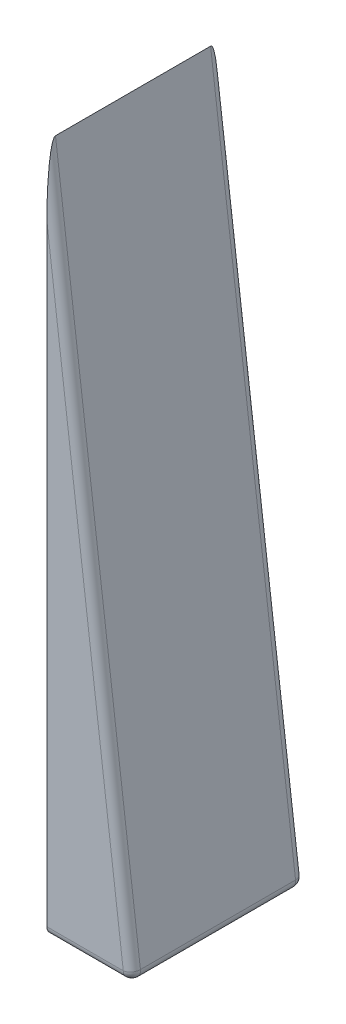
ISO-10303-21;
HEADER;
FILE_DESCRIPTION(('STEP AP214'),'2;1');
FILE_NAME('part.step','',(''),(''),'','','');
FILE_SCHEMA(('AUTOMOTIVE_DESIGN { 1 0 10303 214 1 1 1 1 }'));
ENDSEC;
DATA;
#1=APPLICATION_CONTEXT('core data for automotive mechanical design processes');
#2=APPLICATION_PROTOCOL_DEFINITION('international standard','automotive_design',2000,#1);
#3=PRODUCT_CONTEXT('',#1,'mechanical');
#4=PRODUCT('Part','Part','',(#3));
#5=PRODUCT_RELATED_PRODUCT_CATEGORY('part','',(#4));
#6=PRODUCT_DEFINITION_FORMATION('','',#4);
#7=PRODUCT_DEFINITION_CONTEXT('part definition',#1,'design');
#8=PRODUCT_DEFINITION('design','',#6,#7);
#9=PRODUCT_DEFINITION_SHAPE('','',#8);
#10=(LENGTH_UNIT() NAMED_UNIT(*) SI_UNIT(.MILLI.,.METRE.));
#11=(NAMED_UNIT(*) PLANE_ANGLE_UNIT() SI_UNIT($,.RADIAN.));
#12=(NAMED_UNIT(*) SI_UNIT($,.STERADIAN.) SOLID_ANGLE_UNIT());
#13=UNCERTAINTY_MEASURE_WITH_UNIT(LENGTH_MEASURE(1.E-05),#10,'distance_accuracy_value','');
#14=(GEOMETRIC_REPRESENTATION_CONTEXT(3) GLOBAL_UNCERTAINTY_ASSIGNED_CONTEXT((#13)) GLOBAL_UNIT_ASSIGNED_CONTEXT((#10,
#11,#12)) REPRESENTATION_CONTEXT('',''));
#15=CARTESIAN_POINT('',(0.,0.,0.));
#16=DIRECTION('',(0.,0.,1.));
#17=DIRECTION('',(1.,0.,0.));
#18=AXIS2_PLACEMENT_3D('',#15,#16,#17);
#19=CARTESIAN_POINT('',(-6.35,101.6,-12.7));
#20=DIRECTION('',(0.,0.,1.));
#21=DIRECTION('',(1.,0.,0.));
#22=AXIS2_PLACEMENT_3D('',#19,#20,#21);
#23=PLANE('',#22);
#24=DIRECTION('',(0.124034734589208,-0.992277876713668,0.));
#25=VECTOR('',#24,1.);
#26=CARTESIAN_POINT('',(-7.61019290342636,101.442475887072,-12.7));
#27=LINE('',#26,#25);
#28=CARTESIAN_POINT('',(-6.35,91.3609326596608,-12.7));
#29=VERTEX_POINT('',#28);
#30=CARTESIAN_POINT('',(4.9113665824576,1.26999999999999,-12.7));
#31=VERTEX_POINT('',#30);
#32=EDGE_CURVE('E107',#29,#31,#27,.T.);
#33=ORIENTED_EDGE('',*,*,#32,.T.);
#34=DIRECTION('',(-1.,0.,0.));
#35=VECTOR('',#34,1.);
#36=CARTESIAN_POINT('',(-6.35,1.26999999999999,-12.7));
#37=LINE('',#36,#35);
#38=CARTESIAN_POINT('',(-6.35,1.26999999999999,-12.7));
#39=VERTEX_POINT('',#38);
#40=EDGE_CURVE('E110',#31,#39,#37,.T.);
#41=ORIENTED_EDGE('',*,*,#40,.T.);
#42=DIRECTION('',(0.,-1.,0.));
#43=VECTOR('',#42,1.);
#44=CARTESIAN_POINT('',(-6.35,101.6,-12.7));
#45=LINE('',#44,#43);
#46=EDGE_CURVE('E97',#29,#39,#45,.T.);
#47=ORIENTED_EDGE('',*,*,#46,.F.);
#48=EDGE_LOOP('',(#33,#41,#47));
#49=FACE_BOUND('',#48,.T.);
#50=ADVANCED_FACE('F33',(#49),#23,.F.);
#51=CARTESIAN_POINT('',(-6.35,101.6,12.7));
#52=DIRECTION('',(1.,0.,0.));
#53=DIRECTION('',(0.,0.,-1.));
#54=AXIS2_PLACEMENT_3D('',#51,#52,#53);
#55=PLANE('',#54);
#56=ORIENTED_EDGE('',*,*,#46,.T.);
#57=CARTESIAN_POINT('',(-6.35,1.26999999999999,-11.43));
#58=DIRECTION('',(1.,0.,0.));
#59=DIRECTION('',(0.,0.,-1.));
#60=AXIS2_PLACEMENT_3D('',#57,#58,#59);
#61=CIRCLE('',#60,1.27);
#62=CARTESIAN_POINT('',(-6.35,0.,-11.43));
#63=VERTEX_POINT('',#62);
#64=EDGE_CURVE('E102',#39,#63,#61,.F.);
#65=ORIENTED_EDGE('',*,*,#64,.T.);
#66=DIRECTION('',(0.,0.,1.));
#67=VECTOR('',#66,1.);
#68=CARTESIAN_POINT('',(-6.35,0.,12.7));
#69=LINE('',#68,#67);
#70=CARTESIAN_POINT('',(-6.35,0.,11.43));
#71=VERTEX_POINT('',#70);
#72=EDGE_CURVE('E152',#63,#71,#69,.T.);
#73=ORIENTED_EDGE('',*,*,#72,.T.);
#74=CARTESIAN_POINT('',(-6.35,1.26999999999999,11.43));
#75=DIRECTION('',(1.,0.,0.));
#76=DIRECTION('',(0.,0.,-1.));
#77=AXIS2_PLACEMENT_3D('',#74,#75,#76);
#78=CIRCLE('',#77,1.27);
#79=CARTESIAN_POINT('',(-6.35,1.26999999999999,12.7));
#80=VERTEX_POINT('',#79);
#81=EDGE_CURVE('E103',#71,#80,#78,.F.);
#82=ORIENTED_EDGE('',*,*,#81,.T.);
#83=DIRECTION('',(0.,-1.,0.));
#84=VECTOR('',#83,1.);
#85=CARTESIAN_POINT('',(-6.35,101.6,12.7));
#86=LINE('',#85,#84);
#87=CARTESIAN_POINT('',(-6.35,91.3609326596608,12.7));
#88=VERTEX_POINT('',#87);
#89=EDGE_CURVE('E111',#88,#80,#86,.T.);
#90=ORIENTED_EDGE('',*,*,#89,.F.);
#91=CARTESIAN_POINT('',(-6.35,91.3609326596608,11.43));
#92=DIRECTION('',(1.,0.,0.));
#93=DIRECTION('',(0.,-1.,0.));
#94=AXIS2_PLACEMENT_3D('',#91,#92,#93);
#95=ELLIPSE('',#94,10.2390673403392,1.27);
#96=CARTESIAN_POINT('',(-6.35,101.6,11.43));
#97=VERTEX_POINT('',#96);
#98=EDGE_CURVE('E118',#88,#97,#95,.F.);
#99=ORIENTED_EDGE('',*,*,#98,.T.);
#100=DIRECTION('',(0.,0.,1.));
#101=VECTOR('',#100,1.);
#102=CARTESIAN_POINT('',(-6.35,101.6,12.7));
#103=LINE('',#102,#101);
#104=CARTESIAN_POINT('',(-6.35,101.6,-11.43));
#105=VERTEX_POINT('',#104);
#106=EDGE_CURVE('E99',#105,#97,#103,.T.);
#107=ORIENTED_EDGE('',*,*,#106,.F.);
#108=CARTESIAN_POINT('',(-6.35,91.3609326596608,-11.43));
#109=DIRECTION('',(1.,0.,0.));
#110=DIRECTION('',(0.,-1.,0.));
#111=AXIS2_PLACEMENT_3D('',#108,#109,#110);
#112=ELLIPSE('',#111,10.2390673403392,1.27);
#113=EDGE_CURVE('E94',#105,#29,#112,.F.);
#114=ORIENTED_EDGE('',*,*,#113,.T.);
#115=EDGE_LOOP('',(#56,#65,#73,#82,#90,#99,#107,#114));
#116=FACE_BOUND('',#115,.T.);
#117=ADVANCED_FACE('F96',(#116),#55,.F.);
#118=CARTESIAN_POINT('',(-6.35,101.6,12.7));
#119=DIRECTION('',(0.,0.,-1.));
#120=DIRECTION('',(-1.,0.,0.));
#121=AXIS2_PLACEMENT_3D('',#118,#119,#120);
#122=PLANE('',#121);
#123=ORIENTED_EDGE('',*,*,#89,.T.);
#124=DIRECTION('',(1.,0.,0.));
#125=VECTOR('',#124,1.);
#126=CARTESIAN_POINT('',(6.35,1.26999999999999,12.7));
#127=LINE('',#126,#125);
#128=CARTESIAN_POINT('',(4.9113665824576,1.26999999999999,12.7));
#129=VERTEX_POINT('',#128);
#130=EDGE_CURVE('E11',#80,#129,#127,.T.);
#131=ORIENTED_EDGE('',*,*,#130,.T.);
#132=DIRECTION('',(0.124034734589208,-0.992277876713668,0.));
#133=VECTOR('',#132,1.);
#134=CARTESIAN_POINT('',(-7.61019290342636,101.442475887072,12.7));
#135=LINE('',#134,#133);
#136=EDGE_CURVE('E42',#129,#88,#135,.F.);
#137=ORIENTED_EDGE('',*,*,#136,.T.);
#138=EDGE_LOOP('',(#123,#131,#137));
#139=FACE_BOUND('',#138,.T.);
#140=ADVANCED_FACE('F160',(#139),#122,.F.);
#141=CARTESIAN_POINT('',(0.,0.,0.));
#142=DIRECTION('',(0.,-1.,0.));
#143=DIRECTION('',(0.,0.,-1.));
#144=AXIS2_PLACEMENT_3D('',#141,#142,#143);
#145=PLANE('',#144);
#146=ORIENTED_EDGE('',*,*,#72,.F.);
#147=DIRECTION('',(-1.,0.,0.));
#148=VECTOR('',#147,1.);
#149=CARTESIAN_POINT('',(6.35,0.,-11.43));
#150=LINE('',#149,#148);
#151=CARTESIAN_POINT('',(4.9113665824576,0.,-11.43));
#152=VERTEX_POINT('',#151);
#153=EDGE_CURVE('E129',#63,#152,#150,.F.);
#154=ORIENTED_EDGE('',*,*,#153,.T.);
#155=DIRECTION('',(0.,0.,-1.));
#156=VECTOR('',#155,1.);
#157=CARTESIAN_POINT('',(4.9113665824576,0.,12.7));
#158=LINE('',#157,#156);
#159=CARTESIAN_POINT('',(4.9113665824576,0.,11.43));
#160=VERTEX_POINT('',#159);
#161=EDGE_CURVE('E125',#152,#160,#158,.F.);
#162=ORIENTED_EDGE('',*,*,#161,.T.);
#163=DIRECTION('',(1.,0.,0.));
#164=VECTOR('',#163,1.);
#165=CARTESIAN_POINT('',(-6.35,0.,11.43));
#166=LINE('',#165,#164);
#167=EDGE_CURVE('E127',#160,#71,#166,.F.);
#168=ORIENTED_EDGE('',*,*,#167,.T.);
#169=EDGE_LOOP('',(#146,#154,#162,#168));
#170=FACE_BOUND('',#169,.T.);
#171=ADVANCED_FACE('F165',(#170),#145,.T.);
#172=CARTESIAN_POINT('',(6.35,0.,-12.7));
#173=DIRECTION('',(-0.992277876713668,-0.124034734589208,0.));
#174=DIRECTION('',(0.124034734589208,-0.992277876713668,0.));
#175=AXIS2_PLACEMENT_3D('',#172,#173,#174);
#176=PLANE('',#175);
#177=DIRECTION('',(0.,0.,-1.));
#178=VECTOR('',#177,1.);
#179=CARTESIAN_POINT('',(6.17155948588396,1.42752411292829,-12.7));
#180=LINE('',#179,#178);
#181=CARTESIAN_POINT('',(6.17155948588396,1.42752411292829,11.43));
#182=VERTEX_POINT('',#181);
#183=CARTESIAN_POINT('',(6.17155948588396,1.42752411292829,-11.43));
#184=VERTEX_POINT('',#183);
#185=EDGE_CURVE('E56',#182,#184,#180,.T.);
#186=ORIENTED_EDGE('',*,*,#185,.T.);
#187=DIRECTION('',(0.124034734589208,-0.992277876713668,0.));
#188=VECTOR('',#187,1.);
#189=CARTESIAN_POINT('',(6.35,0.,-11.43));
#190=LINE('',#189,#188);
#191=EDGE_CURVE('E134',#184,#105,#190,.F.);
#192=ORIENTED_EDGE('',*,*,#191,.T.);
#193=ORIENTED_EDGE('',*,*,#106,.T.);
#194=DIRECTION('',(0.124034734589208,-0.992277876713668,0.));
#195=VECTOR('',#194,1.);
#196=CARTESIAN_POINT('',(6.35,0.,11.43));
#197=LINE('',#196,#195);
#198=EDGE_CURVE('E131',#97,#182,#197,.T.);
#199=ORIENTED_EDGE('',*,*,#198,.T.);
#200=EDGE_LOOP('',(#186,#192,#193,#199));
#201=FACE_BOUND('',#200,.T.);
#202=ADVANCED_FACE('F192',(#201),#176,.F.);
#203=CARTESIAN_POINT('',(-6.35,1.26999999999999,11.43));
#204=DIRECTION('',(-1.,0.,0.));
#205=DIRECTION('',(0.,0.,1.));
#206=AXIS2_PLACEMENT_3D('',#203,#204,#205);
#207=CYLINDRICAL_SURFACE('',#206,1.27);
#208=ORIENTED_EDGE('',*,*,#81,.F.);
#209=ORIENTED_EDGE('',*,*,#167,.F.);
#210=CARTESIAN_POINT('',(4.9113665824576,1.26999999999999,11.43));
#211=DIRECTION('',(1.,0.,0.));
#212=DIRECTION('',(0.,1.,0.));
#213=AXIS2_PLACEMENT_3D('',#210,#211,#212);
#214=CIRCLE('',#213,1.27);
#215=EDGE_CURVE('E37',#129,#160,#214,.T.);
#216=ORIENTED_EDGE('',*,*,#215,.F.);
#217=ORIENTED_EDGE('',*,*,#130,.F.);
#218=EDGE_LOOP('',(#208,#209,#216,#217));
#219=FACE_BOUND('',#218,.T.);
#220=ADVANCED_FACE('F35',(#219),#207,.T.);
#221=CARTESIAN_POINT('',(5.08980709657364,-0.157524112928295,11.43));
#222=DIRECTION('',(0.124034734589208,-0.992277876713668,0.));
#223=DIRECTION('',(0.992277876713668,0.124034734589208,0.));
#224=AXIS2_PLACEMENT_3D('',#221,#222,#223);
#225=CYLINDRICAL_SURFACE('',#224,1.27);
#226=ORIENTED_EDGE('',*,*,#98,.F.);
#227=ORIENTED_EDGE('',*,*,#136,.F.);
#228=CARTESIAN_POINT('',(4.9113665824576,1.27,11.43));
#229=DIRECTION('',(0.124034734589208,-0.992277876713668,0.));
#230=DIRECTION('',(0.992277876713668,0.124034734589208,0.));
#231=AXIS2_PLACEMENT_3D('',#228,#229,#230);
#232=CIRCLE('',#231,1.27);
#233=EDGE_CURVE('E146',#182,#129,#232,.T.);
#234=ORIENTED_EDGE('',*,*,#233,.F.);
#235=ORIENTED_EDGE('',*,*,#198,.F.);
#236=EDGE_LOOP('',(#226,#227,#234,#235));
#237=FACE_BOUND('',#236,.T.);
#238=ADVANCED_FACE('F197',(#237),#225,.T.);
#239=CARTESIAN_POINT('',(4.9113665824576,1.27,11.43));
#240=DIRECTION('',(0.,0.,1.));
#241=DIRECTION('',(1.,0.,0.));
#242=AXIS2_PLACEMENT_3D('',#239,#240,#241);
#243=SPHERICAL_SURFACE('',#242,1.27);
#244=ORIENTED_EDGE('',*,*,#233,.T.);
#245=ORIENTED_EDGE('',*,*,#215,.T.);
#246=CARTESIAN_POINT('',(4.9113665824576,1.27,11.43));
#247=DIRECTION('',(0.,0.,1.));
#248=DIRECTION('',(1.,0.,0.));
#249=AXIS2_PLACEMENT_3D('',#246,#247,#248);
#250=CIRCLE('',#249,1.27);
#251=EDGE_CURVE('E144',#182,#160,#250,.F.);
#252=ORIENTED_EDGE('',*,*,#251,.F.);
#253=EDGE_LOOP('',(#244,#245,#252));
#254=FACE_BOUND('',#253,.T.);
#255=ADVANCED_FACE('F201',(#254),#243,.T.);
#256=CARTESIAN_POINT('',(4.9113665824576,1.27,-12.7));
#257=DIRECTION('',(0.,0.,1.));
#258=DIRECTION('',(1.,0.,0.));
#259=AXIS2_PLACEMENT_3D('',#256,#257,#258);
#260=CYLINDRICAL_SURFACE('',#259,1.27);
#261=ORIENTED_EDGE('',*,*,#251,.T.);
#262=ORIENTED_EDGE('',*,*,#161,.F.);
#263=CARTESIAN_POINT('',(4.9113665824576,1.27,-11.43));
#264=DIRECTION('',(0.,0.,-1.));
#265=DIRECTION('',(-1.,0.,0.));
#266=AXIS2_PLACEMENT_3D('',#263,#264,#265);
#267=CIRCLE('',#266,1.27);
#268=EDGE_CURVE('E141',#184,#152,#267,.T.);
#269=ORIENTED_EDGE('',*,*,#268,.F.);
#270=ORIENTED_EDGE('',*,*,#185,.F.);
#271=EDGE_LOOP('',(#261,#262,#269,#270));
#272=FACE_BOUND('',#271,.T.);
#273=ADVANCED_FACE('F170',(#272),#260,.T.);
#274=CARTESIAN_POINT('',(-7.61019290342636,101.442475887072,-11.43));
#275=DIRECTION('',(0.124034734589208,-0.992277876713668,0.));
#276=DIRECTION('',(0.992277876713668,0.124034734589208,0.));
#277=AXIS2_PLACEMENT_3D('',#274,#275,#276);
#278=CYLINDRICAL_SURFACE('',#277,1.27);
#279=ORIENTED_EDGE('',*,*,#113,.F.);
#280=ORIENTED_EDGE('',*,*,#191,.F.);
#281=CARTESIAN_POINT('',(4.9113665824576,1.26999999999999,-11.43));
#282=DIRECTION('',(0.124034734589214,-0.992277876713667,0.));
#283=DIRECTION('',(0.992277876713667,0.124034734589214,0.));
#284=AXIS2_PLACEMENT_3D('',#281,#282,#283);
#285=CIRCLE('',#284,1.27);
#286=EDGE_CURVE('E115',#31,#184,#285,.T.);
#287=ORIENTED_EDGE('',*,*,#286,.F.);
#288=ORIENTED_EDGE('',*,*,#32,.F.);
#289=EDGE_LOOP('',(#279,#280,#287,#288));
#290=FACE_BOUND('',#289,.T.);
#291=ADVANCED_FACE('F113',(#290),#278,.T.);
#292=CARTESIAN_POINT('',(4.9113665824576,1.27,-11.43));
#293=DIRECTION('',(0.,0.,1.));
#294=DIRECTION('',(1.,0.,0.));
#295=AXIS2_PLACEMENT_3D('',#292,#293,#294);
#296=SPHERICAL_SURFACE('',#295,1.27);
#297=ORIENTED_EDGE('',*,*,#286,.T.);
#298=ORIENTED_EDGE('',*,*,#268,.T.);
#299=CARTESIAN_POINT('',(4.9113665824576,1.27,-11.43));
#300=DIRECTION('',(1.,0.,0.));
#301=DIRECTION('',(0.,0.,-1.));
#302=AXIS2_PLACEMENT_3D('',#299,#300,#301);
#303=CIRCLE('',#302,1.27);
#304=EDGE_CURVE('E137',#31,#152,#303,.F.);
#305=ORIENTED_EDGE('',*,*,#304,.F.);
#306=EDGE_LOOP('',(#297,#298,#305));
#307=FACE_BOUND('',#306,.T.);
#308=ADVANCED_FACE('F172',(#307),#296,.T.);
#309=CARTESIAN_POINT('',(-6.35,1.26999999999999,-11.43));
#310=DIRECTION('',(1.,0.,0.));
#311=DIRECTION('',(0.,0.,-1.));
#312=AXIS2_PLACEMENT_3D('',#309,#310,#311);
#313=CYLINDRICAL_SURFACE('',#312,1.27);
#314=ORIENTED_EDGE('',*,*,#304,.T.);
#315=ORIENTED_EDGE('',*,*,#153,.F.);
#316=ORIENTED_EDGE('',*,*,#64,.F.);
#317=ORIENTED_EDGE('',*,*,#40,.F.);
#318=EDGE_LOOP('',(#314,#315,#316,#317));
#319=FACE_BOUND('',#318,.T.);
#320=ADVANCED_FACE('F174',(#319),#313,.T.);
#321=CLOSED_SHELL('',(#50,#117,#140,#171,#202,#220,#238,#255,#273,#291,#308,#320));
#322=MANIFOLD_SOLID_BREP('B2',#321);
#323=ADVANCED_BREP_SHAPE_REPRESENTATION('',(#18,#322),#14);
#324=SHAPE_DEFINITION_REPRESENTATION(#9,#323);
ENDSEC;
END-ISO-10303-21;
